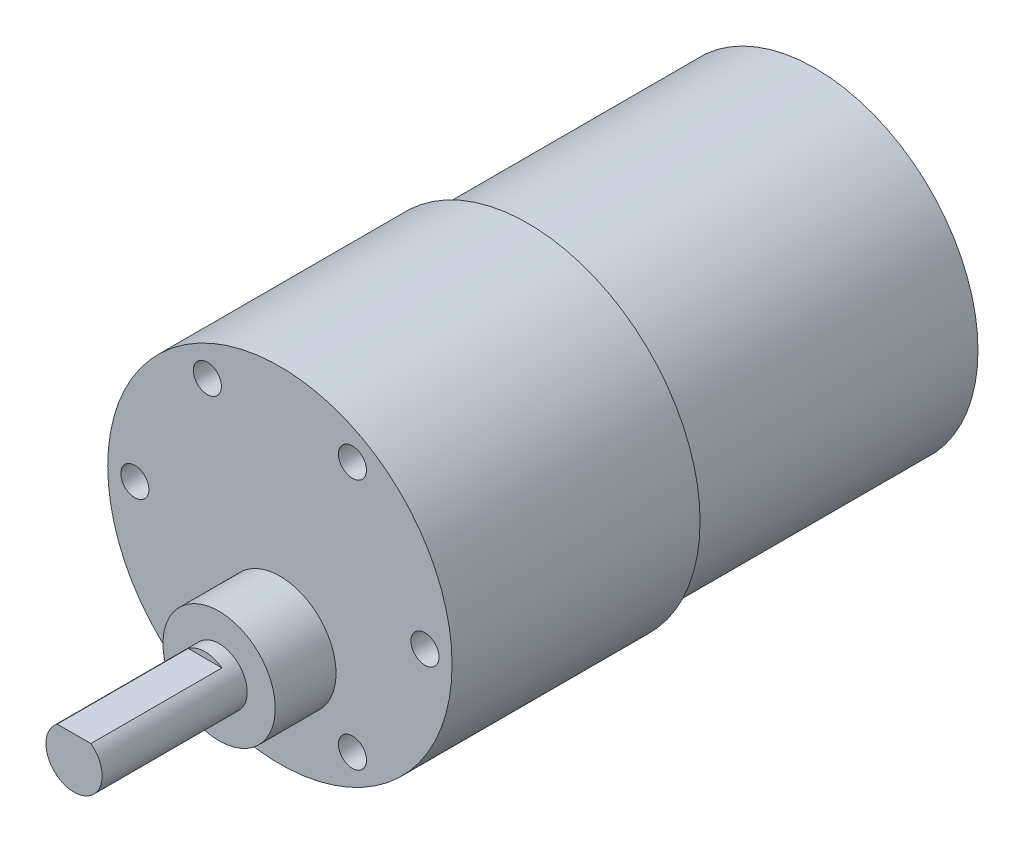
ISO-10303-21;
HEADER;
FILE_DESCRIPTION(('STEP AP214'),'2;1');
FILE_NAME('part.step','',(''),(''),'','','');
FILE_SCHEMA(('AUTOMOTIVE_DESIGN { 1 0 10303 214 1 1 1 1 }'));
ENDSEC;
DATA;
#1=APPLICATION_CONTEXT('core data for automotive mechanical design processes');
#2=APPLICATION_PROTOCOL_DEFINITION('international standard','automotive_design',2000,#1);
#3=PRODUCT_CONTEXT('',#1,'mechanical');
#4=PRODUCT('Part','Part','',(#3));
#5=PRODUCT_RELATED_PRODUCT_CATEGORY('part','',(#4));
#6=PRODUCT_DEFINITION_FORMATION('','',#4);
#7=PRODUCT_DEFINITION_CONTEXT('part definition',#1,'design');
#8=PRODUCT_DEFINITION('design','',#6,#7);
#9=PRODUCT_DEFINITION_SHAPE('','',#8);
#10=(LENGTH_UNIT() NAMED_UNIT(*) SI_UNIT(.MILLI.,.METRE.));
#11=(NAMED_UNIT(*) PLANE_ANGLE_UNIT() SI_UNIT($,.RADIAN.));
#12=(NAMED_UNIT(*) SI_UNIT($,.STERADIAN.) SOLID_ANGLE_UNIT());
#13=UNCERTAINTY_MEASURE_WITH_UNIT(LENGTH_MEASURE(1.E-05),#10,'distance_accuracy_value','');
#14=(GEOMETRIC_REPRESENTATION_CONTEXT(3) GLOBAL_UNCERTAINTY_ASSIGNED_CONTEXT((#13)) GLOBAL_UNIT_ASSIGNED_CONTEXT((#10,
#11,#12)) REPRESENTATION_CONTEXT('',''));
#15=CARTESIAN_POINT('',(0.,0.,0.));
#16=DIRECTION('',(0.,0.,1.));
#17=DIRECTION('',(1.,0.,0.));
#18=AXIS2_PLACEMENT_3D('',#15,#16,#17);
#19=CARTESIAN_POINT('',(0.,-7.,33.));
#20=DIRECTION('',(0.,0.,1.));
#21=DIRECTION('',(1.,0.,0.));
#22=AXIS2_PLACEMENT_3D('',#19,#20,#21);
#23=PLANE('',#22);
#24=CARTESIAN_POINT('',(0.,-7.,33.));
#25=DIRECTION('',(0.,0.,1.));
#26=DIRECTION('',(1.,0.,0.));
#27=AXIS2_PLACEMENT_3D('',#24,#25,#26);
#28=CIRCLE('',#27,6.);
#29=CARTESIAN_POINT('',(-6.,-7.,33.));
#30=VERTEX_POINT('',#29);
#31=EDGE_CURVE('E77',#30,#30,#28,.T.);
#32=ORIENTED_EDGE('',*,*,#31,.T.);
#33=EDGE_LOOP('',(#32));
#34=FACE_BOUND('',#33,.T.);
#35=CARTESIAN_POINT('',(0.,-7.,33.));
#36=DIRECTION('',(0.,0.,1.));
#37=DIRECTION('',(1.,0.,0.));
#38=AXIS2_PLACEMENT_3D('',#35,#36,#37);
#39=CIRCLE('',#38,3.);
#40=CARTESIAN_POINT('',(3.,-7.,33.));
#41=VERTEX_POINT('',#40);
#42=EDGE_CURVE('E74',#41,#41,#39,.T.);
#43=ORIENTED_EDGE('',*,*,#42,.F.);
#44=EDGE_LOOP('',(#43));
#45=FACE_BOUND('',#44,.T.);
#46=ADVANCED_FACE('F35',(#34,#45),#23,.T.);
#47=CARTESIAN_POINT('',(0.,0.,26.5));
#48=DIRECTION('',(0.,0.,1.));
#49=DIRECTION('',(1.,0.,0.));
#50=AXIS2_PLACEMENT_3D('',#47,#48,#49);
#51=PLANE('',#50);
#52=CARTESIAN_POINT('',(-7.75000000000016,-13.4233937586587,26.5));
#53=DIRECTION('',(0.,0.,1.));
#54=DIRECTION('',(1.,0.,0.));
#55=AXIS2_PLACEMENT_3D('',#52,#53,#54);
#56=CIRCLE('',#55,1.5);
#57=CARTESIAN_POINT('',(-6.25000000000015,-13.4233937586587,26.5));
#58=VERTEX_POINT('',#57);
#59=EDGE_CURVE('E191',#58,#58,#56,.T.);
#60=ORIENTED_EDGE('',*,*,#59,.F.);
#61=EDGE_LOOP('',(#60));
#62=FACE_BOUND('',#61,.T.);
#63=CARTESIAN_POINT('',(7.74999999999987,-13.4233937586589,26.5));
#64=DIRECTION('',(0.,0.,1.));
#65=DIRECTION('',(1.,0.,0.));
#66=AXIS2_PLACEMENT_3D('',#63,#64,#65);
#67=CIRCLE('',#66,1.5);
#68=CARTESIAN_POINT('',(9.24999999999988,-13.4233937586589,26.5));
#69=VERTEX_POINT('',#68);
#70=EDGE_CURVE('E190',#69,#69,#67,.T.);
#71=ORIENTED_EDGE('',*,*,#70,.F.);
#72=EDGE_LOOP('',(#71));
#73=FACE_BOUND('',#72,.T.);
#74=CARTESIAN_POINT('',(15.5,-1.08235921504137E-13,26.5));
#75=DIRECTION('',(0.,0.,1.));
#76=DIRECTION('',(1.,0.,0.));
#77=AXIS2_PLACEMENT_3D('',#74,#75,#76);
#78=CIRCLE('',#77,1.5);
#79=CARTESIAN_POINT('',(17.,-1.08235921504137E-13,26.5));
#80=VERTEX_POINT('',#79);
#81=EDGE_CURVE('E200',#80,#80,#78,.T.);
#82=ORIENTED_EDGE('',*,*,#81,.F.);
#83=EDGE_LOOP('',(#82));
#84=FACE_BOUND('',#83,.T.);
#85=CARTESIAN_POINT('',(7.75000000000006,13.4233937586588,26.5));
#86=DIRECTION('',(0.,0.,1.));
#87=DIRECTION('',(1.,0.,0.));
#88=AXIS2_PLACEMENT_3D('',#85,#86,#87);
#89=CIRCLE('',#88,1.5);
#90=CARTESIAN_POINT('',(9.25000000000006,13.4233937586588,26.5));
#91=VERTEX_POINT('',#90);
#92=EDGE_CURVE('E205',#91,#91,#89,.T.);
#93=ORIENTED_EDGE('',*,*,#92,.F.);
#94=EDGE_LOOP('',(#93));
#95=FACE_BOUND('',#94,.T.);
#96=CARTESIAN_POINT('',(-7.74999999999997,13.4233937586588,26.5));
#97=DIRECTION('',(0.,0.,1.));
#98=DIRECTION('',(1.,0.,0.));
#99=AXIS2_PLACEMENT_3D('',#96,#97,#98);
#100=CIRCLE('',#99,1.5);
#101=CARTESIAN_POINT('',(-6.24999999999997,13.4233937586588,26.5));
#102=VERTEX_POINT('',#101);
#103=EDGE_CURVE('E211',#102,#102,#100,.T.);
#104=ORIENTED_EDGE('',*,*,#103,.F.);
#105=EDGE_LOOP('',(#104));
#106=FACE_BOUND('',#105,.T.);
#107=CARTESIAN_POINT('',(-15.5,0.,26.5));
#108=DIRECTION('',(0.,0.,1.));
#109=DIRECTION('',(1.,0.,0.));
#110=AXIS2_PLACEMENT_3D('',#107,#108,#109);
#111=CIRCLE('',#110,1.5);
#112=CARTESIAN_POINT('',(-14.,0.,26.5));
#113=VERTEX_POINT('',#112);
#114=EDGE_CURVE('E217',#113,#113,#111,.T.);
#115=ORIENTED_EDGE('',*,*,#114,.F.);
#116=EDGE_LOOP('',(#115));
#117=FACE_BOUND('',#116,.T.);
#118=CARTESIAN_POINT('',(0.,0.,26.5));
#119=DIRECTION('',(0.,0.,1.));
#120=DIRECTION('',(1.,0.,0.));
#121=AXIS2_PLACEMENT_3D('',#118,#119,#120);
#122=CIRCLE('',#121,18.4);
#123=CARTESIAN_POINT('',(18.4,0.,26.5));
#124=VERTEX_POINT('',#123);
#125=EDGE_CURVE('E91',#124,#124,#122,.T.);
#126=ORIENTED_EDGE('',*,*,#125,.T.);
#127=EDGE_LOOP('',(#126));
#128=FACE_BOUND('',#127,.T.);
#129=CARTESIAN_POINT('',(0.,-7.,26.5));
#130=DIRECTION('',(0.,0.,1.));
#131=DIRECTION('',(1.,0.,0.));
#132=AXIS2_PLACEMENT_3D('',#129,#130,#131);
#133=CIRCLE('',#132,6.);
#134=CARTESIAN_POINT('',(-6.,-7.,26.5));
#135=VERTEX_POINT('',#134);
#136=EDGE_CURVE('E73',#135,#135,#133,.T.);
#137=ORIENTED_EDGE('',*,*,#136,.F.);
#138=EDGE_LOOP('',(#137));
#139=FACE_BOUND('',#138,.T.);
#140=ADVANCED_FACE('F101',(#62,#73,#84,#95,#106,#117,#128,#139),#51,.T.);
#141=CARTESIAN_POINT('',(0.,0.,-52.0430590953299));
#142=DIRECTION('',(0.,0.,1.));
#143=DIRECTION('',(1.,0.,0.));
#144=AXIS2_PLACEMENT_3D('',#141,#142,#143);
#145=CYLINDRICAL_SURFACE('',#144,18.4);
#146=CARTESIAN_POINT('',(0.,0.,0.));
#147=DIRECTION('',(0.,0.,1.));
#148=DIRECTION('',(1.,0.,0.));
#149=AXIS2_PLACEMENT_3D('',#146,#147,#148);
#150=CIRCLE('',#149,18.4);
#151=CARTESIAN_POINT('',(18.4,0.,0.));
#152=VERTEX_POINT('',#151);
#153=EDGE_CURVE('E65',#152,#152,#150,.F.);
#154=ORIENTED_EDGE('',*,*,#153,.F.);
#155=EDGE_LOOP('',(#154));
#156=FACE_BOUND('',#155,.T.);
#157=ORIENTED_EDGE('',*,*,#125,.F.);
#158=EDGE_LOOP('',(#157));
#159=FACE_BOUND('',#158,.T.);
#160=ADVANCED_FACE('F37',(#156,#159),#145,.T.);
#161=CARTESIAN_POINT('',(0.,0.,0.));
#162=DIRECTION('',(0.,0.,1.));
#163=DIRECTION('',(1.,0.,0.));
#164=AXIS2_PLACEMENT_3D('',#161,#162,#163);
#165=PLANE('',#164);
#166=CARTESIAN_POINT('',(0.,0.,0.));
#167=DIRECTION('',(0.,0.,1.));
#168=DIRECTION('',(1.,0.,0.));
#169=AXIS2_PLACEMENT_3D('',#166,#167,#168);
#170=CIRCLE('',#169,17.4);
#171=CARTESIAN_POINT('',(17.4,0.,0.));
#172=VERTEX_POINT('',#171);
#173=EDGE_CURVE('E84',#172,#172,#170,.T.);
#174=ORIENTED_EDGE('',*,*,#173,.T.);
#175=EDGE_LOOP('',(#174));
#176=FACE_BOUND('',#175,.T.);
#177=ORIENTED_EDGE('',*,*,#153,.T.);
#178=EDGE_LOOP('',(#177));
#179=FACE_BOUND('',#178,.T.);
#180=ADVANCED_FACE('F97',(#176,#179),#165,.F.);
#181=CARTESIAN_POINT('',(0.,0.,-79.9146319705837));
#182=DIRECTION('',(0.,0.,1.));
#183=DIRECTION('',(1.,0.,0.));
#184=AXIS2_PLACEMENT_3D('',#181,#182,#183);
#185=CYLINDRICAL_SURFACE('',#184,17.4);
#186=CARTESIAN_POINT('',(0.,0.,-30.7));
#187=DIRECTION('',(0.,0.,1.));
#188=DIRECTION('',(1.,0.,0.));
#189=AXIS2_PLACEMENT_3D('',#186,#187,#188);
#190=CIRCLE('',#189,17.4);
#191=CARTESIAN_POINT('',(17.4,0.,-30.7));
#192=VERTEX_POINT('',#191);
#193=EDGE_CURVE('E88',#192,#192,#190,.F.);
#194=ORIENTED_EDGE('',*,*,#193,.F.);
#195=EDGE_LOOP('',(#194));
#196=FACE_BOUND('',#195,.T.);
#197=ORIENTED_EDGE('',*,*,#173,.F.);
#198=EDGE_LOOP('',(#197));
#199=FACE_BOUND('',#198,.T.);
#200=ADVANCED_FACE('F119',(#196,#199),#185,.T.);
#201=CARTESIAN_POINT('',(0.,0.,-30.7));
#202=DIRECTION('',(0.,0.,1.));
#203=DIRECTION('',(1.,0.,0.));
#204=AXIS2_PLACEMENT_3D('',#201,#202,#203);
#205=PLANE('',#204);
#206=ORIENTED_EDGE('',*,*,#193,.T.);
#207=EDGE_LOOP('',(#206));
#208=FACE_BOUND('',#207,.T.);
#209=ADVANCED_FACE('F111',(#208),#205,.F.);
#210=CARTESIAN_POINT('',(0.,-7.,33.));
#211=DIRECTION('',(0.,0.,-1.));
#212=DIRECTION('',(-1.,0.,0.));
#213=AXIS2_PLACEMENT_3D('',#210,#211,#212);
#214=CYLINDRICAL_SURFACE('',#213,6.);
#215=CARTESIAN_POINT('',(-6.,-7.,33.));
#216=CARTESIAN_POINT('',(-6.,-7.,32.9322916666667));
#217=CARTESIAN_POINT('',(-6.,-7.,32.8645833333333));
#218=CARTESIAN_POINT('',(-6.,-7.,32.7291666666667));
#219=CARTESIAN_POINT('',(-6.,-7.,32.6614583333333));
#220=CARTESIAN_POINT('',(-6.,-7.,32.5260416666667));
#221=CARTESIAN_POINT('',(-6.,-7.,32.4583333333333));
#222=CARTESIAN_POINT('',(-6.,-7.,32.3229166666667));
#223=CARTESIAN_POINT('',(-6.,-7.,32.2552083333333));
#224=CARTESIAN_POINT('',(-6.,-7.,32.1197916666667));
#225=CARTESIAN_POINT('',(-6.,-7.,32.0520833333333));
#226=CARTESIAN_POINT('',(-6.,-7.,31.9166666666667));
#227=CARTESIAN_POINT('',(-6.,-7.,31.8489583333333));
#228=CARTESIAN_POINT('',(-6.,-7.,31.7135416666667));
#229=CARTESIAN_POINT('',(-6.,-7.,31.6458333333333));
#230=CARTESIAN_POINT('',(-6.,-7.,31.5104166666667));
#231=CARTESIAN_POINT('',(-6.,-7.,31.4427083333333));
#232=CARTESIAN_POINT('',(-6.,-7.,31.3072916666667));
#233=CARTESIAN_POINT('',(-6.,-7.,31.2395833333333));
#234=CARTESIAN_POINT('',(-6.,-7.,31.1041666666667));
#235=CARTESIAN_POINT('',(-6.,-7.,31.0364583333333));
#236=CARTESIAN_POINT('',(-6.,-7.,30.9010416666667));
#237=CARTESIAN_POINT('',(-6.,-7.,30.8333333333333));
#238=CARTESIAN_POINT('',(-6.,-7.,30.6979166666667));
#239=CARTESIAN_POINT('',(-6.,-7.,30.6302083333333));
#240=CARTESIAN_POINT('',(-6.,-7.,30.4947916666667));
#241=CARTESIAN_POINT('',(-6.,-7.,30.4270833333333));
#242=CARTESIAN_POINT('',(-6.,-7.,30.2916666666667));
#243=CARTESIAN_POINT('',(-6.,-7.,30.2239583333333));
#244=CARTESIAN_POINT('',(-6.,-7.,30.0885416666667));
#245=CARTESIAN_POINT('',(-6.,-7.,30.0208333333333));
#246=CARTESIAN_POINT('',(-6.,-7.,29.8854166666667));
#247=CARTESIAN_POINT('',(-6.,-7.,29.8177083333333));
#248=CARTESIAN_POINT('',(-6.,-7.,29.6822916666667));
#249=CARTESIAN_POINT('',(-6.,-7.,29.6145833333333));
#250=CARTESIAN_POINT('',(-6.,-7.,29.4791666666667));
#251=CARTESIAN_POINT('',(-6.,-7.,29.4114583333333));
#252=CARTESIAN_POINT('',(-6.,-7.,29.2760416666667));
#253=CARTESIAN_POINT('',(-6.,-7.,29.2083333333333));
#254=CARTESIAN_POINT('',(-6.,-7.,29.0729166666667));
#255=CARTESIAN_POINT('',(-6.,-7.,29.0052083333333));
#256=CARTESIAN_POINT('',(-6.,-7.,28.8697916666667));
#257=CARTESIAN_POINT('',(-6.,-7.,28.8020833333333));
#258=CARTESIAN_POINT('',(-6.,-7.,28.6666666666667));
#259=CARTESIAN_POINT('',(-6.,-7.,28.5989583333333));
#260=CARTESIAN_POINT('',(-6.,-7.,28.4635416666667));
#261=CARTESIAN_POINT('',(-6.,-7.,28.3958333333333));
#262=CARTESIAN_POINT('',(-6.,-7.,28.2604166666667));
#263=CARTESIAN_POINT('',(-6.,-7.,28.1927083333333));
#264=CARTESIAN_POINT('',(-6.,-7.,28.0572916666667));
#265=CARTESIAN_POINT('',(-6.,-7.,27.9895833333333));
#266=CARTESIAN_POINT('',(-6.,-7.,27.8541666666667));
#267=CARTESIAN_POINT('',(-6.,-7.,27.7864583333333));
#268=CARTESIAN_POINT('',(-6.,-7.,27.6510416666667));
#269=CARTESIAN_POINT('',(-6.,-7.,27.5833333333333));
#270=CARTESIAN_POINT('',(-6.,-7.,27.4479166666667));
#271=CARTESIAN_POINT('',(-6.,-7.,27.3802083333333));
#272=CARTESIAN_POINT('',(-6.,-7.,27.2447916666667));
#273=CARTESIAN_POINT('',(-6.,-7.,27.1770833333333));
#274=CARTESIAN_POINT('',(-6.,-7.,27.0416666666667));
#275=CARTESIAN_POINT('',(-6.,-7.,26.9739583333333));
#276=CARTESIAN_POINT('',(-6.,-7.,26.8385416666667));
#277=CARTESIAN_POINT('',(-6.,-7.,26.7708333333333));
#278=CARTESIAN_POINT('',(-6.,-7.,26.6354166666667));
#279=CARTESIAN_POINT('',(-6.,-7.,26.5677083333333));
#280=CARTESIAN_POINT('',(-6.,-7.,26.5));
#281=B_SPLINE_CURVE_WITH_KNOTS('',3,(#215,#216,#217,#218,#219,#220,#221,#222,#223,#224,#225,
#226,#227,#228,#229,#230,#231,#232,#233,#234,#235,#236,#237,#238,#239,#240,#241,#242,#243,#244,
#245,#246,#247,#248,#249,#250,#251,#252,#253,#254,#255,#256,#257,#258,#259,#260,#261,#262,#263,
#264,#265,#266,#267,#268,#269,#270,#271,#272,#273,#274,#275,#276,#277,#278,#279,#280),
.UNSPECIFIED.,.F.,.F.,(4,2,2,2,2,2,2,2,2,2,2,2,2,2,2,2,2,2,2,2,2,2,2,2,2,2,2,2,2,2,2,2,4),(0.,
0.203124999999998,0.406249999999997,0.609374999999995,0.812499999999994,1.015625,1.21875,
1.421875,1.62499999999999,1.828125,2.03124999999999,2.234375,2.4375,2.640625,2.84375,3.046875,
3.25,3.453125,3.65625,3.859375,4.0625,4.26562499999999,4.46875,4.671875,4.875,5.078125,
5.28124999999999,5.484375,5.6875,5.890625,6.09374999999999,6.296875,6.5),.UNSPECIFIED.);
#282=EDGE_CURVE('BSEAM109',#30,#135,#281,.T.);
#283=ORIENTED_EDGE('',*,*,#31,.F.);
#284=ORIENTED_EDGE('',*,*,#136,.T.);
#285=ORIENTED_EDGE('',*,*,#282,.T.);
#286=ORIENTED_EDGE('',*,*,#282,.F.);
#287=EDGE_LOOP('',(#283,#285,#284,#286));
#288=FACE_BOUND('',#287,.T.);
#289=ADVANCED_FACE('F109',(#288),#214,.T.);
#290=CARTESIAN_POINT('',(0.,-7.,48.5));
#291=DIRECTION('',(0.,0.,-1.));
#292=DIRECTION('',(-1.,0.,0.));
#293=AXIS2_PLACEMENT_3D('',#290,#291,#292);
#294=CYLINDRICAL_SURFACE('',#293,3.);
#295=CARTESIAN_POINT('',(0.,-7.,48.5));
#296=DIRECTION('',(0.,0.,1.));
#297=DIRECTION('',(1.,0.,0.));
#298=AXIS2_PLACEMENT_3D('',#295,#296,#297);
#299=CIRCLE('',#298,3.);
#300=CARTESIAN_POINT('',(-1.8,-4.6,48.5));
#301=VERTEX_POINT('',#300);
#302=CARTESIAN_POINT('',(1.8,-4.6,48.5));
#303=VERTEX_POINT('',#302);
#304=EDGE_CURVE('E69',#301,#303,#299,.T.);
#305=ORIENTED_EDGE('',*,*,#304,.F.);
#306=DIRECTION('',(0.,0.,-1.));
#307=VECTOR('',#306,1.);
#308=CARTESIAN_POINT('',(-1.8,-4.6,48.5));
#309=LINE('',#308,#307);
#310=CARTESIAN_POINT('',(-1.8,-4.6,34.5));
#311=VERTEX_POINT('',#310);
#312=EDGE_CURVE('E50',#301,#311,#309,.T.);
#313=ORIENTED_EDGE('',*,*,#312,.T.);
#314=CARTESIAN_POINT('',(0.,-7.,34.5));
#315=DIRECTION('',(0.,0.,-1.));
#316=DIRECTION('',(-1.,0.,0.));
#317=AXIS2_PLACEMENT_3D('',#314,#315,#316);
#318=CIRCLE('',#317,3.);
#319=CARTESIAN_POINT('',(1.8,-4.6,34.5));
#320=VERTEX_POINT('',#319);
#321=EDGE_CURVE('E11',#311,#320,#318,.T.);
#322=ORIENTED_EDGE('',*,*,#321,.T.);
#323=DIRECTION('',(0.,0.,-1.));
#324=VECTOR('',#323,1.);
#325=CARTESIAN_POINT('',(1.8,-4.6,48.5));
#326=LINE('',#325,#324);
#327=EDGE_CURVE('E55',#320,#303,#326,.F.);
#328=ORIENTED_EDGE('',*,*,#327,.T.);
#329=EDGE_LOOP('',(#305,#313,#322,#328));
#330=FACE_BOUND('',#329,.T.);
#331=ORIENTED_EDGE('',*,*,#42,.T.);
#332=EDGE_LOOP('',(#331));
#333=FACE_BOUND('',#332,.T.);
#334=ADVANCED_FACE('F67',(#330,#333),#294,.T.);
#335=CARTESIAN_POINT('',(0.,-7.,48.5));
#336=DIRECTION('',(0.,0.,1.));
#337=DIRECTION('',(1.,0.,0.));
#338=AXIS2_PLACEMENT_3D('',#335,#336,#337);
#339=PLANE('',#338);
#340=DIRECTION('',(1.,0.,0.));
#341=VECTOR('',#340,1.);
#342=CARTESIAN_POINT('',(0.,-4.6,48.5));
#343=LINE('',#342,#341);
#344=EDGE_CURVE('E43',#301,#303,#343,.T.);
#345=ORIENTED_EDGE('',*,*,#344,.F.);
#346=ORIENTED_EDGE('',*,*,#304,.T.);
#347=EDGE_LOOP('',(#345,#346));
#348=FACE_BOUND('',#347,.T.);
#349=ADVANCED_FACE('F72',(#348),#339,.T.);
#350=CARTESIAN_POINT('',(0.,0.,34.5));
#351=DIRECTION('',(0.,0.,-1.));
#352=DIRECTION('',(-1.,0.,0.));
#353=AXIS2_PLACEMENT_3D('',#350,#351,#352);
#354=PLANE('',#353);
#355=DIRECTION('',(1.,0.,0.));
#356=VECTOR('',#355,1.);
#357=CARTESIAN_POINT('',(-4.41143323169157,-4.6,34.5));
#358=LINE('',#357,#356);
#359=EDGE_CURVE('E70',#311,#320,#358,.T.);
#360=ORIENTED_EDGE('',*,*,#359,.T.);
#361=ORIENTED_EDGE('',*,*,#321,.F.);
#362=EDGE_LOOP('',(#360,#361));
#363=FACE_BOUND('',#362,.T.);
#364=ADVANCED_FACE('F132',(#363),#354,.F.);
#365=CARTESIAN_POINT('',(-4.41143323169157,-4.6,34.5));
#366=DIRECTION('',(0.,-1.,0.));
#367=DIRECTION('',(0.,0.,-1.));
#368=AXIS2_PLACEMENT_3D('',#365,#366,#367);
#369=PLANE('',#368);
#370=ORIENTED_EDGE('',*,*,#344,.T.);
#371=ORIENTED_EDGE('',*,*,#327,.F.);
#372=ORIENTED_EDGE('',*,*,#359,.F.);
#373=ORIENTED_EDGE('',*,*,#312,.F.);
#374=EDGE_LOOP('',(#370,#371,#372,#373));
#375=FACE_BOUND('',#374,.T.);
#376=ADVANCED_FACE('F61',(#375),#369,.F.);
#377=CARTESIAN_POINT('',(-15.5,0.,18.5));
#378=DIRECTION('',(0.,0.,1.));
#379=DIRECTION('',(1.,0.,0.));
#380=AXIS2_PLACEMENT_3D('',#377,#378,#379);
#381=CYLINDRICAL_SURFACE('',#380,1.5);
#382=CARTESIAN_POINT('',(-15.5,0.,18.5));
#383=DIRECTION('',(0.,0.,1.));
#384=DIRECTION('',(1.,0.,0.));
#385=AXIS2_PLACEMENT_3D('',#382,#383,#384);
#386=CIRCLE('',#385,1.5);
#387=CARTESIAN_POINT('',(-14.,0.,18.5));
#388=VERTEX_POINT('',#387);
#389=EDGE_CURVE('E220',#388,#388,#386,.T.);
#390=ORIENTED_EDGE('',*,*,#389,.F.);
#391=EDGE_LOOP('',(#390));
#392=FACE_BOUND('',#391,.T.);
#393=ORIENTED_EDGE('',*,*,#114,.T.);
#394=EDGE_LOOP('',(#393));
#395=FACE_BOUND('',#394,.T.);
#396=ADVANCED_FACE('F135',(#392,#395),#381,.F.);
#397=CARTESIAN_POINT('',(-15.5,0.,18.5));
#398=DIRECTION('',(0.,0.,1.));
#399=DIRECTION('',(1.,0.,0.));
#400=AXIS2_PLACEMENT_3D('',#397,#398,#399);
#401=PLANE('',#400);
#402=ORIENTED_EDGE('',*,*,#389,.T.);
#403=EDGE_LOOP('',(#402));
#404=FACE_BOUND('',#403,.T.);
#405=ADVANCED_FACE('F141',(#404),#401,.T.);
#406=CARTESIAN_POINT('',(-7.74999999999997,13.4233937586588,18.5));
#407=DIRECTION('',(0.,0.,1.));
#408=DIRECTION('',(1.,0.,0.));
#409=AXIS2_PLACEMENT_3D('',#406,#407,#408);
#410=CYLINDRICAL_SURFACE('',#409,1.5);
#411=CARTESIAN_POINT('',(-7.74999999999997,13.4233937586588,18.5));
#412=DIRECTION('',(0.,0.,1.));
#413=DIRECTION('',(1.,0.,0.));
#414=AXIS2_PLACEMENT_3D('',#411,#412,#413);
#415=CIRCLE('',#414,1.5);
#416=CARTESIAN_POINT('',(-6.24999999999997,13.4233937586588,18.5));
#417=VERTEX_POINT('',#416);
#418=EDGE_CURVE('E214',#417,#417,#415,.T.);
#419=ORIENTED_EDGE('',*,*,#418,.F.);
#420=EDGE_LOOP('',(#419));
#421=FACE_BOUND('',#420,.T.);
#422=ORIENTED_EDGE('',*,*,#103,.T.);
#423=EDGE_LOOP('',(#422));
#424=FACE_BOUND('',#423,.T.);
#425=ADVANCED_FACE('F145',(#421,#424),#410,.F.);
#426=CARTESIAN_POINT('',(-7.74999999999997,13.4233937586588,18.5));
#427=DIRECTION('',(0.,0.,1.));
#428=DIRECTION('',(1.,0.,0.));
#429=AXIS2_PLACEMENT_3D('',#426,#427,#428);
#430=PLANE('',#429);
#431=ORIENTED_EDGE('',*,*,#418,.T.);
#432=EDGE_LOOP('',(#431));
#433=FACE_BOUND('',#432,.T.);
#434=ADVANCED_FACE('F149',(#433),#430,.T.);
#435=CARTESIAN_POINT('',(7.75000000000006,13.4233937586588,18.5));
#436=DIRECTION('',(0.,0.,1.));
#437=DIRECTION('',(1.,0.,0.));
#438=AXIS2_PLACEMENT_3D('',#435,#436,#437);
#439=CYLINDRICAL_SURFACE('',#438,1.5);
#440=CARTESIAN_POINT('',(7.75000000000006,13.4233937586588,18.5));
#441=DIRECTION('',(0.,0.,1.));
#442=DIRECTION('',(1.,0.,0.));
#443=AXIS2_PLACEMENT_3D('',#440,#441,#442);
#444=CIRCLE('',#443,1.5);
#445=CARTESIAN_POINT('',(9.25000000000006,13.4233937586588,18.5));
#446=VERTEX_POINT('',#445);
#447=EDGE_CURVE('E208',#446,#446,#444,.T.);
#448=ORIENTED_EDGE('',*,*,#447,.F.);
#449=EDGE_LOOP('',(#448));
#450=FACE_BOUND('',#449,.T.);
#451=ORIENTED_EDGE('',*,*,#92,.T.);
#452=EDGE_LOOP('',(#451));
#453=FACE_BOUND('',#452,.T.);
#454=ADVANCED_FACE('F153',(#450,#453),#439,.F.);
#455=CARTESIAN_POINT('',(7.75000000000006,13.4233937586588,18.5));
#456=DIRECTION('',(0.,0.,1.));
#457=DIRECTION('',(1.,0.,0.));
#458=AXIS2_PLACEMENT_3D('',#455,#456,#457);
#459=PLANE('',#458);
#460=ORIENTED_EDGE('',*,*,#447,.T.);
#461=EDGE_LOOP('',(#460));
#462=FACE_BOUND('',#461,.T.);
#463=ADVANCED_FACE('F157',(#462),#459,.T.);
#464=CARTESIAN_POINT('',(15.5,-1.08235921504137E-13,18.5));
#465=DIRECTION('',(0.,0.,1.));
#466=DIRECTION('',(1.,0.,0.));
#467=AXIS2_PLACEMENT_3D('',#464,#465,#466);
#468=CYLINDRICAL_SURFACE('',#467,1.5);
#469=CARTESIAN_POINT('',(15.5,-1.08235921504137E-13,18.5));
#470=DIRECTION('',(0.,0.,1.));
#471=DIRECTION('',(1.,0.,0.));
#472=AXIS2_PLACEMENT_3D('',#469,#470,#471);
#473=CIRCLE('',#472,1.5);
#474=CARTESIAN_POINT('',(17.,-1.08235921504137E-13,18.5));
#475=VERTEX_POINT('',#474);
#476=EDGE_CURVE('E202',#475,#475,#473,.T.);
#477=ORIENTED_EDGE('',*,*,#476,.F.);
#478=EDGE_LOOP('',(#477));
#479=FACE_BOUND('',#478,.T.);
#480=ORIENTED_EDGE('',*,*,#81,.T.);
#481=EDGE_LOOP('',(#480));
#482=FACE_BOUND('',#481,.T.);
#483=ADVANCED_FACE('F161',(#479,#482),#468,.F.);
#484=CARTESIAN_POINT('',(15.5,-1.08235921504137E-13,18.5));
#485=DIRECTION('',(0.,0.,1.));
#486=DIRECTION('',(1.,0.,0.));
#487=AXIS2_PLACEMENT_3D('',#484,#485,#486);
#488=PLANE('',#487);
#489=ORIENTED_EDGE('',*,*,#476,.T.);
#490=EDGE_LOOP('',(#489));
#491=FACE_BOUND('',#490,.T.);
#492=ADVANCED_FACE('F165',(#491),#488,.T.);
#493=CARTESIAN_POINT('',(7.74999999999987,-13.4233937586589,18.5));
#494=DIRECTION('',(0.,0.,1.));
#495=DIRECTION('',(1.,0.,0.));
#496=AXIS2_PLACEMENT_3D('',#493,#494,#495);
#497=CYLINDRICAL_SURFACE('',#496,1.5);
#498=CARTESIAN_POINT('',(7.74999999999987,-13.4233937586589,18.5));
#499=DIRECTION('',(0.,0.,1.));
#500=DIRECTION('',(1.,0.,0.));
#501=AXIS2_PLACEMENT_3D('',#498,#499,#500);
#502=CIRCLE('',#501,1.5);
#503=CARTESIAN_POINT('',(9.24999999999988,-13.4233937586589,18.5));
#504=VERTEX_POINT('',#503);
#505=EDGE_CURVE('E194',#504,#504,#502,.T.);
#506=ORIENTED_EDGE('',*,*,#505,.F.);
#507=EDGE_LOOP('',(#506));
#508=FACE_BOUND('',#507,.T.);
#509=ORIENTED_EDGE('',*,*,#70,.T.);
#510=EDGE_LOOP('',(#509));
#511=FACE_BOUND('',#510,.T.);
#512=ADVANCED_FACE('F169',(#508,#511),#497,.F.);
#513=CARTESIAN_POINT('',(7.74999999999987,-13.4233937586589,18.5));
#514=DIRECTION('',(0.,0.,1.));
#515=DIRECTION('',(1.,0.,0.));
#516=AXIS2_PLACEMENT_3D('',#513,#514,#515);
#517=PLANE('',#516);
#518=ORIENTED_EDGE('',*,*,#505,.T.);
#519=EDGE_LOOP('',(#518));
#520=FACE_BOUND('',#519,.T.);
#521=ADVANCED_FACE('F173',(#520),#517,.T.);
#522=CARTESIAN_POINT('',(-7.75000000000016,-13.4233937586587,18.5));
#523=DIRECTION('',(0.,0.,1.));
#524=DIRECTION('',(1.,0.,0.));
#525=AXIS2_PLACEMENT_3D('',#522,#523,#524);
#526=CYLINDRICAL_SURFACE('',#525,1.5);
#527=CARTESIAN_POINT('',(-7.75000000000016,-13.4233937586587,18.5));
#528=DIRECTION('',(0.,0.,1.));
#529=DIRECTION('',(1.,0.,0.));
#530=AXIS2_PLACEMENT_3D('',#527,#528,#529);
#531=CIRCLE('',#530,1.5);
#532=CARTESIAN_POINT('',(-6.25000000000015,-13.4233937586587,18.5));
#533=VERTEX_POINT('',#532);
#534=EDGE_CURVE('E189',#533,#533,#531,.T.);
#535=ORIENTED_EDGE('',*,*,#534,.F.);
#536=EDGE_LOOP('',(#535));
#537=FACE_BOUND('',#536,.T.);
#538=ORIENTED_EDGE('',*,*,#59,.T.);
#539=EDGE_LOOP('',(#538));
#540=FACE_BOUND('',#539,.T.);
#541=ADVANCED_FACE('F177',(#537,#540),#526,.F.);
#542=CARTESIAN_POINT('',(-7.75000000000016,-13.4233937586587,18.5));
#543=DIRECTION('',(0.,0.,1.));
#544=DIRECTION('',(1.,0.,0.));
#545=AXIS2_PLACEMENT_3D('',#542,#543,#544);
#546=PLANE('',#545);
#547=ORIENTED_EDGE('',*,*,#534,.T.);
#548=EDGE_LOOP('',(#547));
#549=FACE_BOUND('',#548,.T.);
#550=ADVANCED_FACE('F181',(#549),#546,.T.);
#551=CLOSED_SHELL('',(#46,#140,#160,#180,#200,#209,#289,#334,#349,#364,#376,#396,#405,#425,#434,
#454,#463,#483,#492,#512,#521,#541,#550));
#552=MANIFOLD_SOLID_BREP('B2',#551);
#553=ADVANCED_BREP_SHAPE_REPRESENTATION('',(#18,#552),#14);
#554=SHAPE_DEFINITION_REPRESENTATION(#9,#553);
ENDSEC;
END-ISO-10303-21;
